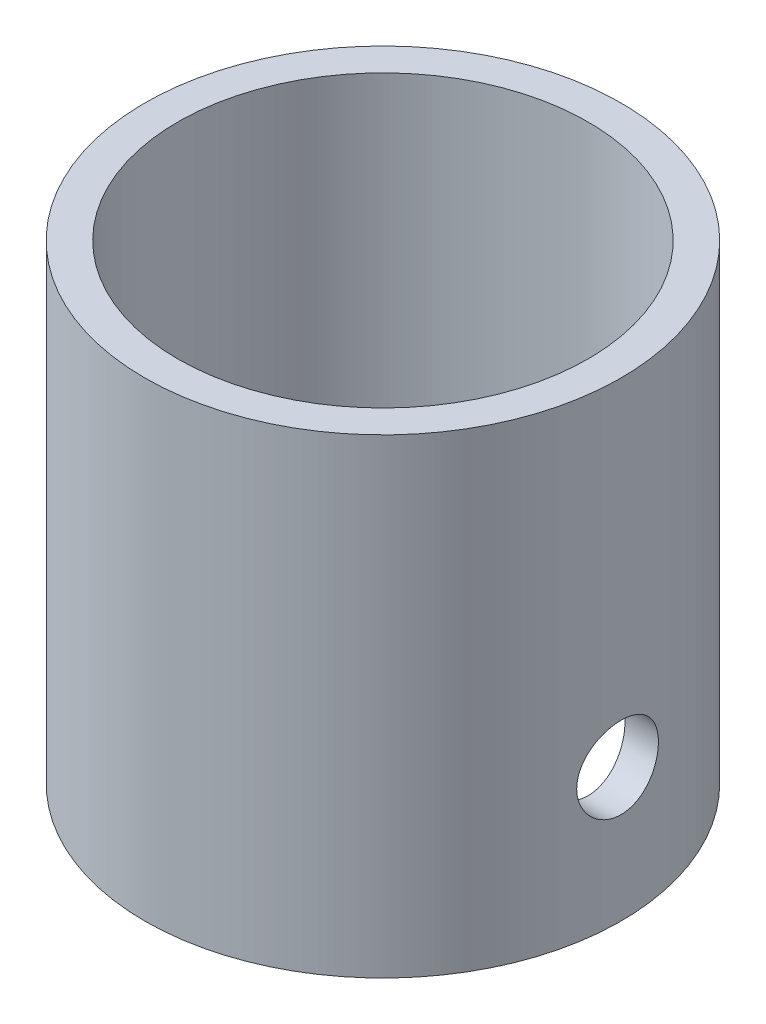
ISO-10303-21;
HEADER;
FILE_DESCRIPTION(('STEP AP214'),'2;1');
FILE_NAME('part.step','',(''),(''),'','','');
FILE_SCHEMA(('AUTOMOTIVE_DESIGN { 1 0 10303 214 1 1 1 1 }'));
ENDSEC;
DATA;
#1=APPLICATION_CONTEXT('core data for automotive mechanical design processes');
#2=APPLICATION_PROTOCOL_DEFINITION('international standard','automotive_design',2000,#1);
#3=PRODUCT_CONTEXT('',#1,'mechanical');
#4=PRODUCT('Part','Part','',(#3));
#5=PRODUCT_RELATED_PRODUCT_CATEGORY('part','',(#4));
#6=PRODUCT_DEFINITION_FORMATION('','',#4);
#7=PRODUCT_DEFINITION_CONTEXT('part definition',#1,'design');
#8=PRODUCT_DEFINITION('design','',#6,#7);
#9=PRODUCT_DEFINITION_SHAPE('','',#8);
#10=(LENGTH_UNIT() NAMED_UNIT(*) SI_UNIT(.MILLI.,.METRE.));
#11=(NAMED_UNIT(*) PLANE_ANGLE_UNIT() SI_UNIT($,.RADIAN.));
#12=(NAMED_UNIT(*) SI_UNIT($,.STERADIAN.) SOLID_ANGLE_UNIT());
#13=UNCERTAINTY_MEASURE_WITH_UNIT(LENGTH_MEASURE(1.E-05),#10,'distance_accuracy_value','');
#14=(GEOMETRIC_REPRESENTATION_CONTEXT(3) GLOBAL_UNCERTAINTY_ASSIGNED_CONTEXT((#13)) GLOBAL_UNIT_ASSIGNED_CONTEXT((#10,
#11,#12)) REPRESENTATION_CONTEXT('',''));
#15=CARTESIAN_POINT('',(0.,0.,0.));
#16=DIRECTION('',(0.,0.,1.));
#17=DIRECTION('',(1.,0.,0.));
#18=AXIS2_PLACEMENT_3D('',#15,#16,#17);
#19=CARTESIAN_POINT('',(0.,40.,0.));
#20=DIRECTION('',(0.,-1.,0.));
#21=DIRECTION('',(0.,0.,-1.));
#22=AXIS2_PLACEMENT_3D('',#19,#20,#21);
#23=CYLINDRICAL_SURFACE('',#22,20.25);
#24=CARTESIAN_POINT('',(0.,40.,0.));
#25=DIRECTION('',(0.,1.,0.));
#26=DIRECTION('',(0.,0.,1.));
#27=AXIS2_PLACEMENT_3D('',#24,#25,#26);
#28=CIRCLE('',#27,20.25);
#29=CARTESIAN_POINT('',(0.,40.,20.25));
#30=VERTEX_POINT('',#29);
#31=EDGE_CURVE('E10',#30,#30,#28,.T.);
#32=ORIENTED_EDGE('',*,*,#31,.F.);
#33=EDGE_LOOP('',(#32));
#34=FACE_BOUND('',#33,.T.);
#35=CARTESIAN_POINT('',(0.,0.,0.));
#36=DIRECTION('',(0.,1.,0.));
#37=DIRECTION('',(0.,0.,1.));
#38=AXIS2_PLACEMENT_3D('',#35,#36,#37);
#39=CIRCLE('',#38,20.25);
#40=CARTESIAN_POINT('',(0.,0.,20.25));
#41=VERTEX_POINT('',#40);
#42=EDGE_CURVE('E48',#41,#41,#39,.T.);
#43=ORIENTED_EDGE('',*,*,#42,.T.);
#44=EDGE_LOOP('',(#43));
#45=FACE_BOUND('',#44,.T.);
#46=CARTESIAN_POINT('',(-19.9496083921464,11.3170451279103,3.475));
#47=CARTESIAN_POINT('',(-19.9496119554284,11.5106892507987,3.47499229212175));
#48=CARTESIAN_POINT('',(-19.9524584193105,11.7044370017485,3.45875895340318));
#49=CARTESIAN_POINT('',(-19.9635254904767,12.0864901725089,3.39428624118366));
#50=CARTESIAN_POINT('',(-19.9717509635413,12.274790503457,3.34601788864452));
#51=CARTESIAN_POINT('',(-19.9926176307497,12.6403646653254,3.21898347511948));
#52=CARTESIAN_POINT('',(-20.0052550379611,12.8176477994879,3.1402435627757));
#53=CARTESIAN_POINT('',(-20.0335171805288,13.1564695144538,2.95456728329486));
#54=CARTESIAN_POINT('',(-20.0491416031954,13.3180097406013,2.84763386709338));
#55=CARTESIAN_POINT('',(-20.0817995968384,13.6224646486712,2.60741506961648));
#56=CARTESIAN_POINT('',(-20.0988449769305,13.7651910690965,2.47389265664507));
#57=CARTESIAN_POINT('',(-20.1323195364419,14.0263305324289,2.18479835206942));
#58=CARTESIAN_POINT('',(-20.148748678425,14.1447421001623,2.02922512361703));
#59=CARTESIAN_POINT('',(-20.1792649803699,14.3546006284567,1.69922158919775));
#60=CARTESIAN_POINT('',(-20.1933366289699,14.445871842346,1.52467796407165));
#61=CARTESIAN_POINT('',(-20.217420857015,14.5977285802619,1.16245422895753));
#62=CARTESIAN_POINT('',(-20.2274337161102,14.6583162184555,0.974775025054787));
#63=CARTESIAN_POINT('',(-20.2421888104843,14.7465086590018,0.593554142891233));
#64=CARTESIAN_POINT('',(-20.2469816032502,14.7744300410048,0.400087691677385));
#65=CARTESIAN_POINT('',(-20.2509303772028,14.7974822632055,0.0111606829670847));
#66=CARTESIAN_POINT('',(-20.2500867635243,14.7926154601585,-0.184299730198622));
#67=CARTESIAN_POINT('',(-20.2428976820867,14.7504754229183,-0.569500242097999));
#68=CARTESIAN_POINT('',(-20.2366100659089,14.7135429286495,-0.759278851432826));
#69=CARTESIAN_POINT('',(-20.2193040361998,14.6088569665037,-1.12990461468857));
#70=CARTESIAN_POINT('',(-20.2082854718853,14.5411025162747,-1.31075148373497));
#71=CARTESIAN_POINT('',(-20.1826574899636,14.3763604968838,-1.65938785285345));
#72=CARTESIAN_POINT('',(-20.1680310059073,14.2792334790638,-1.82711015320612));
#73=CARTESIAN_POINT('',(-20.1368105364047,14.0586056960204,-2.14400408176159));
#74=CARTESIAN_POINT('',(-20.1202163824483,13.9351026712441,-2.29317411891466));
#75=CARTESIAN_POINT('',(-20.0866525340583,13.6633415142902,-2.57074365665181));
#76=CARTESIAN_POINT('',(-20.0696807544148,13.5147854958667,-2.69885142355954));
#77=CARTESIAN_POINT('',(-20.037480296745,13.1981364011325,-2.92837102121037));
#78=CARTESIAN_POINT('',(-20.022251636731,13.0300431229722,-3.02978257610566));
#79=CARTESIAN_POINT('',(-19.9952601202495,12.6787417777271,-3.20309419854191));
#80=CARTESIAN_POINT('',(-19.9835015867886,12.4955152183958,-3.2749574989621));
#81=CARTESIAN_POINT('',(-19.9648518866713,12.1193438696073,-3.38680314181522));
#82=CARTESIAN_POINT('',(-19.9579602639571,11.9263999925347,-3.42678847144382));
#83=CARTESIAN_POINT('',(-19.9499133938224,11.5388858531448,-3.47332891962505));
#84=CARTESIAN_POINT('',(-19.9486866645379,11.3443670628176,-3.48030064563496));
#85=CARTESIAN_POINT('',(-19.9519178792309,10.9569426996066,-3.46172767060196));
#86=CARTESIAN_POINT('',(-19.9563755898277,10.7640370608205,-3.4361843045008));
#87=CARTESIAN_POINT('',(-19.9704072465844,10.3866487070714,-3.35366199428109));
#88=CARTESIAN_POINT('',(-19.979946432614,10.2021179014196,-3.29689654187864));
#89=CARTESIAN_POINT('',(-20.0030368710581,9.84518789886841,-3.15376591878192));
#90=CARTESIAN_POINT('',(-20.0165883763711,9.67278946752621,-3.06739888223165));
#91=CARTESIAN_POINT('',(-20.0463418831593,9.34316808236864,-2.86653903798983));
#92=CARTESIAN_POINT('',(-20.0625684475078,9.18610954626196,-2.75178011705268));
#93=CARTESIAN_POINT('',(-20.0957725401498,8.89332914554728,-2.49775787511724));
#94=CARTESIAN_POINT('',(-20.1127501244991,8.75760887707042,-2.35849272266949));
#95=CARTESIAN_POINT('',(-20.145770239241,8.50982836449084,-2.05756206768462));
#96=CARTESIAN_POINT('',(-20.1618003466949,8.39804649324301,-1.89566578661292));
#97=CARTESIAN_POINT('',(-20.1909179122454,8.20326903851403,-1.55514993274976));
#98=CARTESIAN_POINT('',(-20.2040054698727,8.12027248132771,-1.37653092588847));
#99=CARTESIAN_POINT('',(-20.225709457151,7.98585109795857,-1.00845375212857));
#100=CARTESIAN_POINT('',(-20.2343461985822,7.93428264560273,-0.819049286704075));
#101=CARTESIAN_POINT('',(-20.2462614799996,7.86371969231799,-0.434107519142288));
#102=CARTESIAN_POINT('',(-20.2495404885613,7.84472234278472,-0.238570754847036));
#103=CARTESIAN_POINT('',(-20.250363614773,7.83992674807383,0.150402208473067));
#104=CARTESIAN_POINT('',(-20.2479807734498,7.85370567318767,0.343833169558939));
#105=CARTESIAN_POINT('',(-20.2378976464002,7.91315432397091,0.725581892300486));
#106=CARTESIAN_POINT('',(-20.2301973949172,7.95882384426981,0.91389968687605));
#107=CARTESIAN_POINT('',(-20.210342158907,8.08059132673054,1.27990079904003));
#108=CARTESIAN_POINT('',(-20.1981927430104,8.15665126265543,1.45759708863077));
#109=CARTESIAN_POINT('',(-20.170762915617,8.33699267777502,1.79777063997277));
#110=CARTESIAN_POINT('',(-20.1554823414027,8.44127562373151,1.96024711015265));
#111=CARTESIAN_POINT('',(-20.1232491497502,8.67659204510104,2.26749387086216));
#112=CARTESIAN_POINT('',(-20.1062785207791,8.80793425087002,2.41202584525345));
#113=CARTESIAN_POINT('',(-20.0727000569621,9.09299432084194,2.67714702200563));
#114=CARTESIAN_POINT('',(-20.0560923080438,9.2467174200542,2.79773060706817));
#115=CARTESIAN_POINT('',(-20.0249841455586,9.57355706176316,3.01237365486972));
#116=CARTESIAN_POINT('',(-20.0105005942642,9.74681129985456,3.10622592432627));
#117=CARTESIAN_POINT('',(-19.9854806998735,10.1068077888033,3.26334864578423));
#118=CARTESIAN_POINT('',(-19.974940464728,10.2935365219863,3.32664927022998));
#119=CARTESIAN_POINT('',(-19.9613067734667,10.6203028931825,3.4073227542615));
#120=CARTESIAN_POINT('',(-19.9569446425809,10.7583758597518,3.43266038616189));
#121=CARTESIAN_POINT('',(-19.9510941904314,11.0366295057625,3.46650163156872));
#122=CARTESIAN_POINT('',(-19.9496058116561,11.1768101429671,3.47500558196228));
#123=CARTESIAN_POINT('',(-19.9496083921464,11.3170451279103,3.475));
#124=B_SPLINE_CURVE_WITH_KNOTS('',3,(#46,#47,#48,#49,#50,#51,#52,#53,#54,#55,#56,#57,#58,#59,
#60,#61,#62,#63,#64,#65,#66,#67,#68,#69,#70,#71,#72,#73,#74,#75,#76,#77,#78,#79,#80,#81,#82,#83,
#84,#85,#86,#87,#88,#89,#90,#91,#92,#93,#94,#95,#96,#97,#98,#99,#100,#101,#102,#103,#104,#105,
#106,#107,#108,#109,#110,#111,#112,#113,#114,#115,#116,#117,#118,#119,#120,#121,#122,#123),
.UNSPECIFIED.,.T.,.F.,(4,2,2,2,2,2,2,2,2,2,2,2,2,2,2,2,2,2,2,2,2,2,2,2,2,2,2,2,2,2,2,2,2,2,2,2,
2,2,4),(0.,0.580419471956675,1.16136471130301,1.74181252406497,2.32219960707199,
2.90801305212773,3.49386202779077,4.08342593297392,4.67294921035523,5.2567106093008,
5.84043004897973,6.41802158672493,6.99563153465479,7.57602797007221,8.15647414625412,
8.74438379629168,9.3322995208699,9.92094459568505,10.5095345037274,11.0906766825591,
11.671795002749,12.2489882555632,12.82621789689,13.4090776501024,13.9919809812876,
14.5813332170048,15.1706655150794,15.7572839689341,16.3438511156791,16.9228923847922,
17.5019299250034,18.0802451977412,18.6585905315423,19.2439414121214,19.8294294299914,
20.4193391752963,21.0086651345038,21.4290070673247,21.8493405878906),.UNSPECIFIED.);
#125=CARTESIAN_POINT('',(-19.9496083921464,11.3170451279103,3.475));
#126=VERTEX_POINT('',#125);
#127=EDGE_CURVE('E76',#126,#126,#124,.T.);
#128=ORIENTED_EDGE('',*,*,#127,.F.);
#129=EDGE_LOOP('',(#128));
#130=FACE_BOUND('',#129,.T.);
#131=CARTESIAN_POINT('',(19.9496083921464,11.3170451279103,3.475));
#132=CARTESIAN_POINT('',(19.9496119554284,11.1234010050219,3.47499229212175));
#133=CARTESIAN_POINT('',(19.9524584193105,10.9296532540721,3.45875895340318));
#134=CARTESIAN_POINT('',(19.9635254904767,10.5476000833117,3.39428624118366));
#135=CARTESIAN_POINT('',(19.9717509635413,10.3592997523636,3.34601788864452));
#136=CARTESIAN_POINT('',(19.9926176307497,9.99372559049527,3.21898347511948));
#137=CARTESIAN_POINT('',(20.0052550379611,9.81644245633273,3.1402435627757));
#138=CARTESIAN_POINT('',(20.0335171805288,9.47762074136685,2.95456728329486));
#139=CARTESIAN_POINT('',(20.0491416031954,9.31608051521932,2.84763386709338));
#140=CARTESIAN_POINT('',(20.0817995968384,9.01162560714938,2.60741506961648));
#141=CARTESIAN_POINT('',(20.0988449769305,8.86889918672412,2.47389265664507));
#142=CARTESIAN_POINT('',(20.1323195364419,8.60775972339172,2.18479835206942));
#143=CARTESIAN_POINT('',(20.148748678425,8.48934815565836,2.02922512361703));
#144=CARTESIAN_POINT('',(20.1792649803699,8.27948962736396,1.69922158919775));
#145=CARTESIAN_POINT('',(20.1933366289699,8.1882184134746,1.52467796407165));
#146=CARTESIAN_POINT('',(20.217420857015,8.03636167555869,1.16245422895753));
#147=CARTESIAN_POINT('',(20.2274337161102,7.97577403736509,0.974775025054787));
#148=CARTESIAN_POINT('',(20.2421888104843,7.88758159681887,0.593554142891233));
#149=CARTESIAN_POINT('',(20.2469816032502,7.85966021481579,0.400087691677384));
#150=CARTESIAN_POINT('',(20.2509303772028,7.83660799261516,0.0111606829670843));
#151=CARTESIAN_POINT('',(20.2500867635243,7.84147479566213,-0.184299730198623));
#152=CARTESIAN_POINT('',(20.2428976820867,7.88361483290234,-0.569500242097999));
#153=CARTESIAN_POINT('',(20.2366100659089,7.92054732717114,-0.759278851432825));
#154=CARTESIAN_POINT('',(20.2193040361998,8.02523328931696,-1.12990461468857));
#155=CARTESIAN_POINT('',(20.2082854718853,8.09298773954589,-1.31075148373497));
#156=CARTESIAN_POINT('',(20.1826574899636,8.25772975893687,-1.65938785285345));
#157=CARTESIAN_POINT('',(20.1680310059073,8.3548567767568,-1.82711015320612));
#158=CARTESIAN_POINT('',(20.1368105364047,8.57548455980027,-2.14400408176159));
#159=CARTESIAN_POINT('',(20.1202163824483,8.69898758457649,-2.29317411891466));
#160=CARTESIAN_POINT('',(20.0866525340583,8.97074874153038,-2.57074365665181));
#161=CARTESIAN_POINT('',(20.0696807544148,9.11930475995392,-2.69885142355954));
#162=CARTESIAN_POINT('',(20.037480296745,9.43595385468816,-2.92837102121037));
#163=CARTESIAN_POINT('',(20.022251636731,9.60404713284846,-3.02978257610566));
#164=CARTESIAN_POINT('',(19.9952601202495,9.95534847809355,-3.20309419854191));
#165=CARTESIAN_POINT('',(19.9835015867886,10.1385750374248,-3.2749574989621));
#166=CARTESIAN_POINT('',(19.9648518866713,10.5147463862133,-3.38680314181522));
#167=CARTESIAN_POINT('',(19.9579602639571,10.7076902632859,-3.42678847144382));
#168=CARTESIAN_POINT('',(19.9499133938224,11.0952044026758,-3.47332891962505));
#169=CARTESIAN_POINT('',(19.9486866645379,11.2897231930031,-3.48030064563496));
#170=CARTESIAN_POINT('',(19.9519178792309,11.6771475562141,-3.46172767060196));
#171=CARTESIAN_POINT('',(19.9563755898277,11.8700531950002,-3.4361843045008));
#172=CARTESIAN_POINT('',(19.9704072465844,12.2474415487493,-3.35366199428109));
#173=CARTESIAN_POINT('',(19.979946432614,12.431972354401,-3.29689654187864));
#174=CARTESIAN_POINT('',(20.0030368710581,12.7889023569522,-3.15376591878192));
#175=CARTESIAN_POINT('',(20.0165883763711,12.9613007882944,-3.06739888223165));
#176=CARTESIAN_POINT('',(20.0463418831593,13.290922173452,-2.86653903798983));
#177=CARTESIAN_POINT('',(20.0625684475078,13.4479807095587,-2.75178011705267));
#178=CARTESIAN_POINT('',(20.0957725401498,13.7407611102733,-2.49775787511724));
#179=CARTESIAN_POINT('',(20.1127501244991,13.8764813787502,-2.35849272266949));
#180=CARTESIAN_POINT('',(20.145770239241,14.1242618913298,-2.05756206768462));
#181=CARTESIAN_POINT('',(20.1618003466949,14.2360437625776,-1.89566578661292));
#182=CARTESIAN_POINT('',(20.1909179122454,14.4308212173066,-1.55514993274976));
#183=CARTESIAN_POINT('',(20.2040054698727,14.5138177744929,-1.37653092588847));
#184=CARTESIAN_POINT('',(20.225709457151,14.6482391578621,-1.00845375212857));
#185=CARTESIAN_POINT('',(20.2343461985822,14.6998076102179,-0.819049286704076));
#186=CARTESIAN_POINT('',(20.2462614799996,14.7703705635026,-0.434107519142288));
#187=CARTESIAN_POINT('',(20.2495404885613,14.7893679130359,-0.238570754847036));
#188=CARTESIAN_POINT('',(20.250363614773,14.7941635077468,0.150402208473067));
#189=CARTESIAN_POINT('',(20.2479807734498,14.780384582633,0.343833169558938));
#190=CARTESIAN_POINT('',(20.2378976464002,14.7209359318497,0.725581892300485));
#191=CARTESIAN_POINT('',(20.2301973949172,14.6752664115508,0.913899686876051));
#192=CARTESIAN_POINT('',(20.210342158907,14.5534989290901,1.27990079904003));
#193=CARTESIAN_POINT('',(20.1981927430104,14.4774389931652,1.45759708863077));
#194=CARTESIAN_POINT('',(20.170762915617,14.2970975780456,1.79777063997277));
#195=CARTESIAN_POINT('',(20.1554823414027,14.1928146320891,1.96024711015265));
#196=CARTESIAN_POINT('',(20.1232491497502,13.9574982107196,2.26749387086216));
#197=CARTESIAN_POINT('',(20.1062785207791,13.8261560049506,2.41202584525345));
#198=CARTESIAN_POINT('',(20.0727000569621,13.5410959349787,2.67714702200563));
#199=CARTESIAN_POINT('',(20.0560923080438,13.3873728357664,2.79773060706817));
#200=CARTESIAN_POINT('',(20.0249841455586,13.0605331940575,3.01237365486972));
#201=CARTESIAN_POINT('',(20.0105005942642,12.8872789559661,3.10622592432628));
#202=CARTESIAN_POINT('',(19.9854806998735,12.5272824670174,3.26334864578423));
#203=CARTESIAN_POINT('',(19.974940464728,12.3405537338344,3.32664927022998));
#204=CARTESIAN_POINT('',(19.9613067734667,12.0137873626381,3.4073227542615));
#205=CARTESIAN_POINT('',(19.9569446425809,11.8757143960688,3.4326603861619));
#206=CARTESIAN_POINT('',(19.9510941904314,11.5974607500581,3.46650163156872));
#207=CARTESIAN_POINT('',(19.9496058116561,11.4572801128535,3.47500558196228));
#208=CARTESIAN_POINT('',(19.9496083921464,11.3170451279103,3.475));
#209=B_SPLINE_CURVE_WITH_KNOTS('',3,(#131,#132,#133,#134,#135,#136,#137,#138,#139,#140,#141,
#142,#143,#144,#145,#146,#147,#148,#149,#150,#151,#152,#153,#154,#155,#156,#157,#158,#159,#160,
#161,#162,#163,#164,#165,#166,#167,#168,#169,#170,#171,#172,#173,#174,#175,#176,#177,#178,#179,
#180,#181,#182,#183,#184,#185,#186,#187,#188,#189,#190,#191,#192,#193,#194,#195,#196,#197,#198,
#199,#200,#201,#202,#203,#204,#205,#206,#207,#208),.UNSPECIFIED.,.T.,.F.,(4,2,2,2,2,2,2,2,2,2,2,
2,2,2,2,2,2,2,2,2,2,2,2,2,2,2,2,2,2,2,2,2,2,2,2,2,2,2,4),(0.,0.580419471956673,1.16136471130301,
1.74181252406497,2.32219960707199,2.90801305212773,3.49386202779077,4.08342593297392,
4.67294921035523,5.2567106093008,5.84043004897973,6.41802158672493,6.99563153465479,
7.57602797007221,8.15647414625412,8.74438379629168,9.3322995208699,9.92094459568505,
10.5095345037274,11.0906766825591,11.671795002749,12.2489882555632,12.82621789689,
13.4090776501024,13.9919809812876,14.5813332170048,15.1706655150794,15.7572839689341,
16.3438511156791,16.9228923847922,17.5019299250034,18.0802451977412,18.6585905315423,
19.2439414121214,19.8294294299914,20.4193391752963,21.0086651345038,21.4290070673247,
21.8493405878906),.UNSPECIFIED.);
#210=CARTESIAN_POINT('',(19.9496083921464,11.3170451279103,3.475));
#211=VERTEX_POINT('',#210);
#212=EDGE_CURVE('E81',#211,#211,#209,.T.);
#213=ORIENTED_EDGE('',*,*,#212,.F.);
#214=EDGE_LOOP('',(#213));
#215=FACE_BOUND('',#214,.T.);
#216=ADVANCED_FACE('F35',(#34,#45,#130,#215),#23,.T.);
#217=CARTESIAN_POINT('',(0.,40.,0.));
#218=DIRECTION('',(0.,-1.,0.));
#219=DIRECTION('',(0.,0.,-1.));
#220=AXIS2_PLACEMENT_3D('',#217,#218,#219);
#221=CYLINDRICAL_SURFACE('',#220,17.4512109609333);
#222=CARTESIAN_POINT('',(-17.101729123191,11.3170451279103,3.475));
#223=CARTESIAN_POINT('',(-17.1017329566684,11.5101497929568,3.47499284095974));
#224=CARTESIAN_POINT('',(-17.1050353503812,11.7033448191875,3.45884918777018));
#225=CARTESIAN_POINT('',(-17.11786891837,12.0842707801252,3.39475419725087));
#226=CARTESIAN_POINT('',(-17.1274050980894,12.2719971971537,3.34677729882495));
#227=CARTESIAN_POINT('',(-17.1515843549896,12.6364197511737,3.22056144261149));
#228=CARTESIAN_POINT('',(-17.1662223744997,12.8131266085469,3.14235244684095));
#229=CARTESIAN_POINT('',(-17.1989499620243,13.1509056431979,2.95797429052897));
#230=CARTESIAN_POINT('',(-17.2170393319025,13.3119787171841,2.85180673490778));
#231=CARTESIAN_POINT('',(-17.2549147159134,13.6161847048743,2.61293858522064));
#232=CARTESIAN_POINT('',(-17.274719204945,13.7590665490465,2.47992112498593));
#233=CARTESIAN_POINT('',(-17.3136307135902,14.020642626198,2.19181366377547));
#234=CARTESIAN_POINT('',(-17.3327376844642,14.1393351715811,2.03672212405533));
#235=CARTESIAN_POINT('',(-17.3683004730018,14.3501367639679,1.70720737475016));
#236=CARTESIAN_POINT('',(-17.3847319676504,14.4420073582929,1.53262876887391));
#237=CARTESIAN_POINT('',(-17.4128849377808,14.5950186515657,1.17013162217653));
#238=CARTESIAN_POINT('',(-17.4246068502541,14.6561622017388,0.982214320927599));
#239=CARTESIAN_POINT('',(-17.441889396088,14.74520257436,0.600979349621176));
#240=CARTESIAN_POINT('',(-17.4475285212936,14.7735233046498,0.407764304025128));
#241=CARTESIAN_POINT('',(-17.452281163723,14.7974365647933,0.0192485353454399));
#242=CARTESIAN_POINT('',(-17.4513953045105,14.7930322220357,-0.17605198665737));
#243=CARTESIAN_POINT('',(-17.4432586491996,14.7519421354997,-0.560282359791615));
#244=CARTESIAN_POINT('',(-17.4360978853932,14.7157129958145,-0.749263224562864));
#245=CARTESIAN_POINT('',(-17.4163175061436,14.6127258172972,-1.11840842588832));
#246=CARTESIAN_POINT('',(-17.4036976736387,14.5459665645308,-1.29857241155158));
#247=CARTESIAN_POINT('',(-17.3742686019465,14.383390337423,-1.64627382055824));
#248=CARTESIAN_POINT('',(-17.3574336511488,14.2873942146306,-1.81372521353497));
#249=CARTESIAN_POINT('',(-17.3214306270737,14.069201751033,-2.13031185561953));
#250=CARTESIAN_POINT('',(-17.3022622876681,13.947002420483,-2.27944501158883));
#251=CARTESIAN_POINT('',(-17.2633193629667,13.6773666494693,-2.55787120994531));
#252=CARTESIAN_POINT('',(-17.2435400253337,13.5295306165702,-2.68677690363453));
#253=CARTESIAN_POINT('',(-17.2059187094584,13.2141400418769,-2.91802897296361));
#254=CARTESIAN_POINT('',(-17.1880767672276,13.046585133677,-3.0203748549698));
#255=CARTESIAN_POINT('',(-17.156341218413,12.695959834915,-3.19573401163791));
#256=CARTESIAN_POINT('',(-17.1424560084985,12.5128575032746,-3.26868504058063));
#257=CARTESIAN_POINT('',(-17.1203296309462,12.1366542178316,-3.3826739423815));
#258=CARTESIAN_POINT('',(-17.1120877347122,11.9435545582265,-3.42371593503981));
#259=CARTESIAN_POINT('',(-17.1023269885567,11.556347428916,-3.47214377143235));
#260=CARTESIAN_POINT('',(-17.1006964554442,11.362312631575,-3.48008877348194));
#261=CARTESIAN_POINT('',(-17.1040433324889,10.9756900905013,-3.46360132421019));
#262=CARTESIAN_POINT('',(-17.1090203714163,10.7831022660854,-3.43917069183291));
#263=CARTESIAN_POINT('',(-17.1249170589721,10.4067170592979,-3.35910737672477));
#264=CARTESIAN_POINT('',(-17.1357798533521,10.2228535910522,-3.30377305753674));
#265=CARTESIAN_POINT('',(-17.1621742960397,9.86700735481774,-3.16379195718542));
#266=CARTESIAN_POINT('',(-17.177706326079,9.69502555962504,-3.07914277931074));
#267=CARTESIAN_POINT('',(-17.2119403229176,9.36537667798583,-2.88166757334957));
#268=CARTESIAN_POINT('',(-17.2306806742492,9.20792339262028,-2.76849142725493));
#269=CARTESIAN_POINT('',(-17.2691142391195,8.91403953264667,-2.51764203249844));
#270=CARTESIAN_POINT('',(-17.2888075496832,8.77761110461525,-2.37996628558661));
#271=CARTESIAN_POINT('',(-17.3272903045258,8.52753185765036,-2.08151655931277));
#272=CARTESIAN_POINT('',(-17.3460614499071,8.41425896134417,-1.92042316720817));
#273=CARTESIAN_POINT('',(-17.3802673729591,8.21638582641138,-1.58116825848002));
#274=CARTESIAN_POINT('',(-17.3957022899418,8.13178439045701,-1.40300745499473));
#275=CARTESIAN_POINT('',(-17.4214184857415,7.9942076062884,-1.03567218056129));
#276=CARTESIAN_POINT('',(-17.4317287661486,7.94105395371865,-0.846566609799187));
#277=CARTESIAN_POINT('',(-17.4461583409242,7.86731633761041,-0.461885517247563));
#278=CARTESIAN_POINT('',(-17.4502783741374,7.84672848712429,-0.266310770442931));
#279=CARTESIAN_POINT('',(-17.4518459680246,7.83885633232505,0.122146177823592));
#280=CARTESIAN_POINT('',(-17.4494074066552,7.8510036491829,0.315016627639449));
#281=CARTESIAN_POINT('',(-17.4383710411551,7.90700276405272,0.695909180603568));
#282=CARTESIAN_POINT('',(-17.4297733130891,7.95085417052419,0.883931343597706));
#283=CARTESIAN_POINT('',(-17.4073876460954,8.06876499442203,1.24943977854889));
#284=CARTESIAN_POINT('',(-17.3936113505903,8.14275667583909,1.4269486596654));
#285=CARTESIAN_POINT('',(-17.3623524771543,8.31877612232461,1.76711371185874));
#286=CARTESIAN_POINT('',(-17.3448696094885,8.42080607926931,1.92976872041753));
#287=CARTESIAN_POINT('',(-17.3077675157921,8.65192589579135,2.23842074724053));
#288=CARTESIAN_POINT('',(-17.2881185788639,8.78142266623917,2.38410953173198));
#289=CARTESIAN_POINT('',(-17.2490761646826,9.0629635569168,2.65188443976885));
#290=CARTESIAN_POINT('',(-17.2296827489961,9.2150130067279,2.77396496852944));
#291=CARTESIAN_POINT('',(-17.1931196422551,9.53928721359162,2.99229323708871));
#292=CARTESIAN_POINT('',(-17.1759758597201,9.71170976011453,3.08825172846719));
#293=CARTESIAN_POINT('',(-17.1461692229671,10.0705236840646,3.24968270065452));
#294=CARTESIAN_POINT('',(-17.1335022945854,10.256902172676,3.31518291726541));
#295=CARTESIAN_POINT('',(-17.1166201324916,10.589267212825,3.40109304437335));
#296=CARTESIAN_POINT('',(-17.111070509906,10.7333544402746,3.42875871137151));
#297=CARTESIAN_POINT('',(-17.103623612359,11.023958857076,3.46571459448768));
#298=CARTESIAN_POINT('',(-17.1017262135276,11.1704759638452,3.47500543381252));
#299=CARTESIAN_POINT('',(-17.101729123191,11.3170451279103,3.475));
#300=B_SPLINE_CURVE_WITH_KNOTS('',3,(#222,#223,#224,#225,#226,#227,#228,#229,#230,#231,#232,
#233,#234,#235,#236,#237,#238,#239,#240,#241,#242,#243,#244,#245,#246,#247,#248,#249,#250,#251,
#252,#253,#254,#255,#256,#257,#258,#259,#260,#261,#262,#263,#264,#265,#266,#267,#268,#269,#270,
#271,#272,#273,#274,#275,#276,#277,#278,#279,#280,#281,#282,#283,#284,#285,#286,#287,#288,#289,
#290,#291,#292,#293,#294,#295,#296,#297,#298,#299),.UNSPECIFIED.,.T.,.F.,(4,2,2,2,2,2,2,2,2,2,2,
2,2,2,2,2,2,2,2,2,2,2,2,2,2,2,2,2,2,2,2,2,2,2,2,2,2,2,4),(0.,0.578777356860159,1.15802001709104,
1.73669007512441,2.31532692268743,2.90124016624813,3.48719427278897,4.07820919955148,
4.66916927470144,5.25240890096526,5.83559279034867,6.41054369613247,6.98551746502552,
7.56408778367139,8.14272415143946,8.73135890682634,9.32000460164044,9.90989032683002,
10.4996998787675,11.0795034196047,11.6592743870107,12.2335423051958,12.8078571852148,
13.3895967057994,13.9713955810006,14.5620417434199,15.1526632372589,15.7399030788116,
16.3270728240474,16.9041135519575,17.4811471536275,18.0568910461548,18.6326799599433,
19.2176832409829,19.8028249891484,20.3942043112214,20.9850440539445,21.4243591303308,
21.8636593065041),.UNSPECIFIED.);
#301=CARTESIAN_POINT('',(-17.101729123191,11.3170451279103,3.475));
#302=VERTEX_POINT('',#301);
#303=EDGE_CURVE('E58',#302,#302,#300,.T.);
#304=ORIENTED_EDGE('',*,*,#303,.T.);
#305=EDGE_LOOP('',(#304));
#306=FACE_BOUND('',#305,.T.);
#307=CARTESIAN_POINT('',(0.,40.,0.));
#308=DIRECTION('',(0.,1.,0.));
#309=DIRECTION('',(0.,0.,1.));
#310=AXIS2_PLACEMENT_3D('',#307,#308,#309);
#311=CIRCLE('',#310,17.4512109609333);
#312=CARTESIAN_POINT('',(0.,40.,17.4512109609333));
#313=VERTEX_POINT('',#312);
#314=EDGE_CURVE('E53',#313,#313,#311,.T.);
#315=ORIENTED_EDGE('',*,*,#314,.T.);
#316=EDGE_LOOP('',(#315));
#317=FACE_BOUND('',#316,.T.);
#318=CARTESIAN_POINT('',(0.,0.,0.));
#319=DIRECTION('',(0.,1.,0.));
#320=DIRECTION('',(0.,0.,1.));
#321=AXIS2_PLACEMENT_3D('',#318,#319,#320);
#322=CIRCLE('',#321,17.4512109609333);
#323=CARTESIAN_POINT('',(0.,0.,17.4512109609333));
#324=VERTEX_POINT('',#323);
#325=EDGE_CURVE('E56',#324,#324,#322,.T.);
#326=ORIENTED_EDGE('',*,*,#325,.F.);
#327=EDGE_LOOP('',(#326));
#328=FACE_BOUND('',#327,.T.);
#329=CARTESIAN_POINT('',(17.101729123191,11.3170451279103,3.475));
#330=CARTESIAN_POINT('',(17.1017329566684,11.1239404628639,3.47499284095974));
#331=CARTESIAN_POINT('',(17.1050353503812,10.9307454366331,3.45884918777018));
#332=CARTESIAN_POINT('',(17.11786891837,10.5498194756954,3.39475419725087));
#333=CARTESIAN_POINT('',(17.1274050980894,10.3620930586669,3.34677729882495));
#334=CARTESIAN_POINT('',(17.1515843549896,9.99767050464687,3.22056144261149));
#335=CARTESIAN_POINT('',(17.1662223744997,9.82096364727374,3.14235244684095));
#336=CARTESIAN_POINT('',(17.1989499620243,9.48318461262276,2.95797429052897));
#337=CARTESIAN_POINT('',(17.2170393319025,9.32211153863657,2.85180673490778));
#338=CARTESIAN_POINT('',(17.2549147159134,9.01790555094631,2.61293858522064));
#339=CARTESIAN_POINT('',(17.274719204945,8.87502370677415,2.47992112498593));
#340=CARTESIAN_POINT('',(17.3136307135902,8.61344762962258,2.19181366377547));
#341=CARTESIAN_POINT('',(17.3327376844642,8.49475508423955,2.03672212405533));
#342=CARTESIAN_POINT('',(17.3683004730018,8.28395349185272,1.70720737475016));
#343=CARTESIAN_POINT('',(17.3847319676504,8.19208289752777,1.53262876887391));
#344=CARTESIAN_POINT('',(17.4128849377808,8.03907160425491,1.17013162217652));
#345=CARTESIAN_POINT('',(17.4246068502541,7.97792805408186,0.982214320927599));
#346=CARTESIAN_POINT('',(17.441889396088,7.88888768146067,0.600979349621175));
#347=CARTESIAN_POINT('',(17.4475285212936,7.86056695117087,0.407764304025127));
#348=CARTESIAN_POINT('',(17.452281163723,7.83665369102727,0.0192485353454394));
#349=CARTESIAN_POINT('',(17.4513953045105,7.84105803378492,-0.17605198665737));
#350=CARTESIAN_POINT('',(17.4432586491996,7.88214812032097,-0.560282359791616));
#351=CARTESIAN_POINT('',(17.4360978853932,7.91837726000611,-0.749263224562865));
#352=CARTESIAN_POINT('',(17.4163175061436,8.02136443852341,-1.11840842588832));
#353=CARTESIAN_POINT('',(17.4036976736387,8.08812369128985,-1.29857241155158));
#354=CARTESIAN_POINT('',(17.3742686019465,8.25069991839758,-1.64627382055824));
#355=CARTESIAN_POINT('',(17.3574336511488,8.34669604119001,-1.81372521353497));
#356=CARTESIAN_POINT('',(17.3214306270737,8.56488850478766,-2.13031185561953));
#357=CARTESIAN_POINT('',(17.3022622876681,8.68708783533764,-2.27944501158883));
#358=CARTESIAN_POINT('',(17.2633193629667,8.95672360635136,-2.55787120994531));
#359=CARTESIAN_POINT('',(17.2435400253337,9.10455963925044,-2.68677690363453));
#360=CARTESIAN_POINT('',(17.2059187094584,9.41995021394373,-2.91802897296361));
#361=CARTESIAN_POINT('',(17.1880767672276,9.58750512214365,-3.0203748549698));
#362=CARTESIAN_POINT('',(17.156341218413,9.93813042090565,-3.19573401163791));
#363=CARTESIAN_POINT('',(17.1424560084985,10.121232752546,-3.26868504058063));
#364=CARTESIAN_POINT('',(17.1203296309462,10.497436037989,-3.3826739423815));
#365=CARTESIAN_POINT('',(17.1120877347122,10.6905356975941,-3.42371593503981));
#366=CARTESIAN_POINT('',(17.1023269885567,11.0777428269046,-3.47214377143235));
#367=CARTESIAN_POINT('',(17.1006964554442,11.2717776242456,-3.48008877348194));
#368=CARTESIAN_POINT('',(17.1040433324889,11.6584001653193,-3.46360132421019));
#369=CARTESIAN_POINT('',(17.1090203714163,11.8509879897353,-3.43917069183291));
#370=CARTESIAN_POINT('',(17.1249170589721,12.2273731965227,-3.35910737672477));
#371=CARTESIAN_POINT('',(17.1357798533521,12.4112366647684,-3.30377305753674));
#372=CARTESIAN_POINT('',(17.1621742960397,12.7670829010029,-3.16379195718542));
#373=CARTESIAN_POINT('',(17.177706326079,12.9390646961956,-3.07914277931074));
#374=CARTESIAN_POINT('',(17.2119403229176,13.2687135778348,-2.88166757334957));
#375=CARTESIAN_POINT('',(17.2306806742492,13.4261668632003,-2.76849142725494));
#376=CARTESIAN_POINT('',(17.2691142391195,13.720050723174,-2.51764203249844));
#377=CARTESIAN_POINT('',(17.2888075496832,13.8564791512054,-2.37996628558661));
#378=CARTESIAN_POINT('',(17.3272903045258,14.1065583981703,-2.08151655931277));
#379=CARTESIAN_POINT('',(17.3460614499071,14.2198312944765,-1.92042316720817));
#380=CARTESIAN_POINT('',(17.3802673729591,14.4177044294092,-1.58116825848002));
#381=CARTESIAN_POINT('',(17.3957022899418,14.5023058653636,-1.40300745499473));
#382=CARTESIAN_POINT('',(17.4214184857415,14.6398826495322,-1.03567218056129));
#383=CARTESIAN_POINT('',(17.4317287661486,14.693036302102,-0.846566609799187));
#384=CARTESIAN_POINT('',(17.4461583409242,14.7667739182102,-0.461885517247563));
#385=CARTESIAN_POINT('',(17.4502783741374,14.7873617686963,-0.26631077044293));
#386=CARTESIAN_POINT('',(17.4518459680246,14.7952339234956,0.122146177823592));
#387=CARTESIAN_POINT('',(17.4494074066552,14.7830866066377,0.31501662763945));
#388=CARTESIAN_POINT('',(17.4383710411551,14.7270874917679,0.695909180603568));
#389=CARTESIAN_POINT('',(17.4297733130891,14.6832360852964,0.883931343597706));
#390=CARTESIAN_POINT('',(17.4073876460954,14.5653252613986,1.24943977854889));
#391=CARTESIAN_POINT('',(17.3936113505903,14.4913335799815,1.4269486596654));
#392=CARTESIAN_POINT('',(17.3623524771543,14.315314133496,1.76711371185874));
#393=CARTESIAN_POINT('',(17.3448696094885,14.2132841765513,1.92976872041753));
#394=CARTESIAN_POINT('',(17.3077675157921,13.9821643600293,2.23842074724053));
#395=CARTESIAN_POINT('',(17.2881185788639,13.8526675895815,2.38410953173197));
#396=CARTESIAN_POINT('',(17.2490761646826,13.5711266989038,2.65188443976885));
#397=CARTESIAN_POINT('',(17.2296827489961,13.4190772490927,2.77396496852944));
#398=CARTESIAN_POINT('',(17.1931196422551,13.094803042229,2.99229323708871));
#399=CARTESIAN_POINT('',(17.1759758597201,12.9223804957061,3.08825172846719));
#400=CARTESIAN_POINT('',(17.1461692229671,12.563566571756,3.24968270065452));
#401=CARTESIAN_POINT('',(17.1335022945854,12.3771880831447,3.31518291726541));
#402=CARTESIAN_POINT('',(17.1166201324916,12.0448230429956,3.40109304437335));
#403=CARTESIAN_POINT('',(17.111070509906,11.900735815546,3.42875871137151));
#404=CARTESIAN_POINT('',(17.103623612359,11.6101313987446,3.46571459448768));
#405=CARTESIAN_POINT('',(17.1017262135276,11.4636142919754,3.47500543381252));
#406=CARTESIAN_POINT('',(17.101729123191,11.3170451279103,3.475));
#407=B_SPLINE_CURVE_WITH_KNOTS('',3,(#329,#330,#331,#332,#333,#334,#335,#336,#337,#338,#339,
#340,#341,#342,#343,#344,#345,#346,#347,#348,#349,#350,#351,#352,#353,#354,#355,#356,#357,#358,
#359,#360,#361,#362,#363,#364,#365,#366,#367,#368,#369,#370,#371,#372,#373,#374,#375,#376,#377,
#378,#379,#380,#381,#382,#383,#384,#385,#386,#387,#388,#389,#390,#391,#392,#393,#394,#395,#396,
#397,#398,#399,#400,#401,#402,#403,#404,#405,#406),.UNSPECIFIED.,.T.,.F.,(4,2,2,2,2,2,2,2,2,2,2,
2,2,2,2,2,2,2,2,2,2,2,2,2,2,2,2,2,2,2,2,2,2,2,2,2,2,2,4),(0.,0.578777356860159,1.15802001709104,
1.73669007512441,2.31532692268743,2.90124016624813,3.48719427278897,4.07820919955148,
4.66916927470144,5.25240890096526,5.83559279034867,6.41054369613247,6.98551746502552,
7.5640877836714,8.14272415143946,8.73135890682633,9.32000460164043,9.90989032683001,
10.4996998787675,11.0795034196047,11.6592743870107,12.2335423051958,12.8078571852148,
13.3895967057994,13.9713955810006,14.5620417434199,15.1526632372589,15.7399030788116,
16.3270728240474,16.9041135519575,17.4811471536275,18.0568910461548,18.6326799599433,
19.2176832409829,19.8028249891484,20.3942043112214,20.9850440539445,21.4243591303308,
21.8636593065041),.UNSPECIFIED.);
#408=CARTESIAN_POINT('',(17.101729123191,11.3170451279103,3.475));
#409=VERTEX_POINT('',#408);
#410=EDGE_CURVE('E39',#409,#409,#407,.T.);
#411=ORIENTED_EDGE('',*,*,#410,.T.);
#412=EDGE_LOOP('',(#411));
#413=FACE_BOUND('',#412,.T.);
#414=ADVANCED_FACE('F63',(#306,#317,#328,#413),#221,.F.);
#415=CARTESIAN_POINT('',(0.,40.,0.));
#416=DIRECTION('',(0.,1.,0.));
#417=DIRECTION('',(0.,0.,1.));
#418=AXIS2_PLACEMENT_3D('',#415,#416,#417);
#419=PLANE('',#418);
#420=ORIENTED_EDGE('',*,*,#31,.T.);
#421=EDGE_LOOP('',(#420));
#422=FACE_BOUND('',#421,.T.);
#423=ORIENTED_EDGE('',*,*,#314,.F.);
#424=EDGE_LOOP('',(#423));
#425=FACE_BOUND('',#424,.T.);
#426=ADVANCED_FACE('F96',(#422,#425),#419,.T.);
#427=CARTESIAN_POINT('',(0.,0.,0.));
#428=DIRECTION('',(0.,1.,0.));
#429=DIRECTION('',(0.,0.,1.));
#430=AXIS2_PLACEMENT_3D('',#427,#428,#429);
#431=PLANE('',#430);
#432=ORIENTED_EDGE('',*,*,#42,.F.);
#433=EDGE_LOOP('',(#432));
#434=FACE_BOUND('',#433,.T.);
#435=ORIENTED_EDGE('',*,*,#325,.T.);
#436=EDGE_LOOP('',(#435));
#437=FACE_BOUND('',#436,.T.);
#438=ADVANCED_FACE('F92',(#434,#437),#431,.F.);
#439=CARTESIAN_POINT('',(40.,11.3170451279103,0.));
#440=DIRECTION('',(-1.,0.,0.));
#441=DIRECTION('',(0.,0.,1.));
#442=AXIS2_PLACEMENT_3D('',#439,#440,#441);
#443=CYLINDRICAL_SURFACE('',#442,3.475);
#444=ORIENTED_EDGE('',*,*,#303,.F.);
#445=EDGE_LOOP('',(#444));
#446=FACE_BOUND('',#445,.T.);
#447=ORIENTED_EDGE('',*,*,#127,.T.);
#448=EDGE_LOOP('',(#447));
#449=FACE_BOUND('',#448,.T.);
#450=ADVANCED_FACE('F69',(#446,#449),#443,.F.);
#451=ORIENTED_EDGE('',*,*,#410,.F.);
#452=EDGE_LOOP('',(#451));
#453=FACE_BOUND('',#452,.T.);
#454=ORIENTED_EDGE('',*,*,#212,.T.);
#455=EDGE_LOOP('',(#454));
#456=FACE_BOUND('',#455,.T.);
#457=ADVANCED_FACE('F66',(#453,#456),#443,.F.);
#458=CLOSED_SHELL('',(#216,#414,#426,#438,#450,#457));
#459=MANIFOLD_SOLID_BREP('B2',#458);
#460=ADVANCED_BREP_SHAPE_REPRESENTATION('',(#18,#459),#14);
#461=SHAPE_DEFINITION_REPRESENTATION(#9,#460);
ENDSEC;
END-ISO-10303-21;
